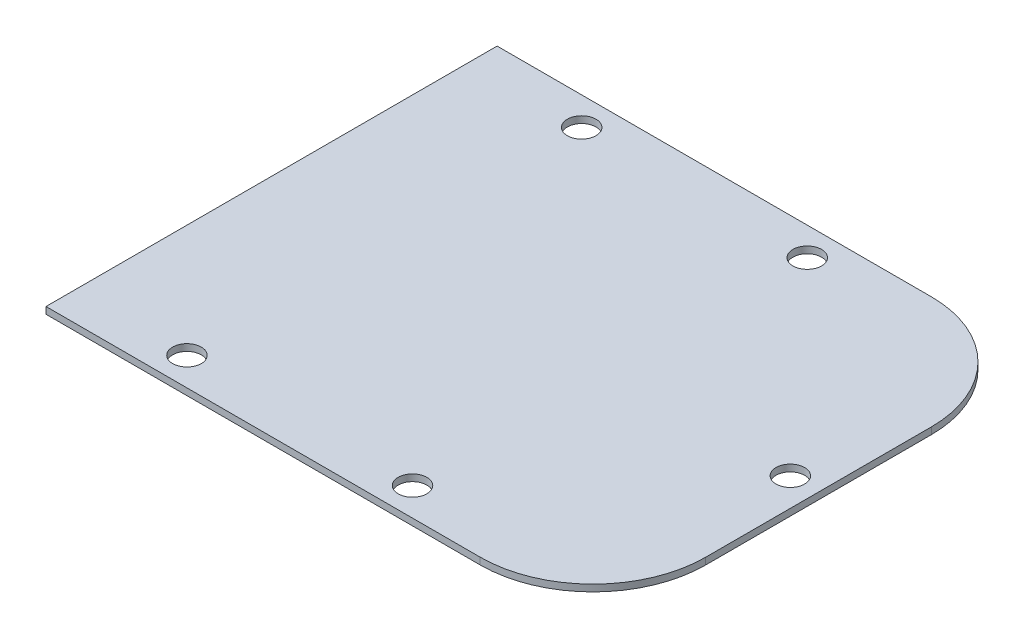
ISO-10303-21;
HEADER;
FILE_DESCRIPTION(('STEP AP214'),'2;1');
FILE_NAME('part.step','',(''),(''),'','','');
FILE_SCHEMA(('AUTOMOTIVE_DESIGN { 1 0 10303 214 1 1 1 1 }'));
ENDSEC;
DATA;
#1=APPLICATION_CONTEXT('core data for automotive mechanical design processes');
#2=APPLICATION_PROTOCOL_DEFINITION('international standard','automotive_design',2000,#1);
#3=PRODUCT_CONTEXT('',#1,'mechanical');
#4=PRODUCT('Part','Part','',(#3));
#5=PRODUCT_RELATED_PRODUCT_CATEGORY('part','',(#4));
#6=PRODUCT_DEFINITION_FORMATION('','',#4);
#7=PRODUCT_DEFINITION_CONTEXT('part definition',#1,'design');
#8=PRODUCT_DEFINITION('design','',#6,#7);
#9=PRODUCT_DEFINITION_SHAPE('','',#8);
#10=(LENGTH_UNIT() NAMED_UNIT(*) SI_UNIT(.MILLI.,.METRE.));
#11=(NAMED_UNIT(*) PLANE_ANGLE_UNIT() SI_UNIT($,.RADIAN.));
#12=(NAMED_UNIT(*) SI_UNIT($,.STERADIAN.) SOLID_ANGLE_UNIT());
#13=UNCERTAINTY_MEASURE_WITH_UNIT(LENGTH_MEASURE(1.E-05),#10,'distance_accuracy_value','');
#14=(GEOMETRIC_REPRESENTATION_CONTEXT(3) GLOBAL_UNCERTAINTY_ASSIGNED_CONTEXT((#13)) GLOBAL_UNIT_ASSIGNED_CONTEXT((#10,
#11,#12)) REPRESENTATION_CONTEXT('',''));
#15=CARTESIAN_POINT('',(0.,0.,0.));
#16=DIRECTION('',(0.,0.,1.));
#17=DIRECTION('',(1.,0.,0.));
#18=AXIS2_PLACEMENT_3D('',#15,#16,#17);
#19=CARTESIAN_POINT('',(15.39875,0.381,-12.7));
#20=DIRECTION('',(0.,-1.,0.));
#21=DIRECTION('',(0.,0.,-1.));
#22=AXIS2_PLACEMENT_3D('',#19,#20,#21);
#23=PLANE('',#22);
#24=CARTESIAN_POINT('',(3.65124999999999,0.381,-11.1125));
#25=DIRECTION('',(0.,1.,0.));
#26=DIRECTION('',(0.,0.,1.));
#27=AXIS2_PLACEMENT_3D('',#24,#25,#26);
#28=CIRCLE('',#27,0.806449999999997);
#29=CARTESIAN_POINT('',(3.65124999999999,0.381,-10.30605));
#30=VERTEX_POINT('',#29);
#31=EDGE_CURVE('E282',#30,#30,#28,.T.);
#32=ORIENTED_EDGE('',*,*,#31,.F.);
#33=EDGE_LOOP('',(#32));
#34=FACE_BOUND('',#33,.T.);
#35=DIRECTION('',(0.,0.,-1.));
#36=VECTOR('',#35,1.);
#37=CARTESIAN_POINT('',(15.39875,0.381,12.7));
#38=LINE('',#37,#36);
#39=CARTESIAN_POINT('',(15.39875,0.381,6.35));
#40=VERTEX_POINT('',#39);
#41=CARTESIAN_POINT('',(15.39875,0.381,-6.35));
#42=VERTEX_POINT('',#41);
#43=EDGE_CURVE('E99',#40,#42,#38,.T.);
#44=ORIENTED_EDGE('',*,*,#43,.T.);
#45=CARTESIAN_POINT('',(9.04874999999999,0.381,-6.35));
#46=DIRECTION('',(0.,-1.,0.));
#47=DIRECTION('',(0.,0.,-1.));
#48=AXIS2_PLACEMENT_3D('',#45,#46,#47);
#49=CIRCLE('',#48,6.35);
#50=CARTESIAN_POINT('',(9.04874999999999,0.381,-12.7));
#51=VERTEX_POINT('',#50);
#52=EDGE_CURVE('E42',#42,#51,#49,.F.);
#53=ORIENTED_EDGE('',*,*,#52,.T.);
#54=DIRECTION('',(-1.,0.,0.));
#55=VECTOR('',#54,1.);
#56=CARTESIAN_POINT('',(-15.39875,0.381,-12.7));
#57=LINE('',#56,#55);
#58=CARTESIAN_POINT('',(-15.39875,0.381,-12.7));
#59=VERTEX_POINT('',#58);
#60=EDGE_CURVE('E89',#51,#59,#57,.T.);
#61=ORIENTED_EDGE('',*,*,#60,.T.);
#62=DIRECTION('',(0.,0.,1.));
#63=VECTOR('',#62,1.);
#64=CARTESIAN_POINT('',(-15.39875,0.381,12.7));
#65=LINE('',#64,#63);
#66=CARTESIAN_POINT('',(-15.39875,0.381,12.7));
#67=VERTEX_POINT('',#66);
#68=EDGE_CURVE('E93',#59,#67,#65,.T.);
#69=ORIENTED_EDGE('',*,*,#68,.T.);
#70=DIRECTION('',(1.,0.,0.));
#71=VECTOR('',#70,1.);
#72=CARTESIAN_POINT('',(-15.39875,0.381,12.7));
#73=LINE('',#72,#71);
#74=CARTESIAN_POINT('',(9.04874999999999,0.381,12.7));
#75=VERTEX_POINT('',#74);
#76=EDGE_CURVE('E113',#67,#75,#73,.T.);
#77=ORIENTED_EDGE('',*,*,#76,.T.);
#78=CARTESIAN_POINT('',(9.04874999999999,0.381,6.35));
#79=DIRECTION('',(0.,-1.,0.));
#80=DIRECTION('',(0.,0.,-1.));
#81=AXIS2_PLACEMENT_3D('',#78,#79,#80);
#82=CIRCLE('',#81,6.35);
#83=EDGE_CURVE('E136',#75,#40,#82,.F.);
#84=ORIENTED_EDGE('',*,*,#83,.T.);
#85=EDGE_LOOP('',(#44,#53,#61,#69,#77,#84));
#86=FACE_BOUND('',#85,.T.);
#87=CARTESIAN_POINT('',(3.65124999999999,0.381,11.1125));
#88=DIRECTION('',(0.,1.,0.));
#89=DIRECTION('',(0.,0.,1.));
#90=AXIS2_PLACEMENT_3D('',#87,#88,#89);
#91=CIRCLE('',#90,0.806449999999997);
#92=CARTESIAN_POINT('',(3.65124999999999,0.381,11.91895));
#93=VERTEX_POINT('',#92);
#94=EDGE_CURVE('E140',#93,#93,#91,.T.);
#95=ORIENTED_EDGE('',*,*,#94,.F.);
#96=EDGE_LOOP('',(#95));
#97=FACE_BOUND('',#96,.T.);
#98=CARTESIAN_POINT('',(-9.04875000000001,0.381,11.1125));
#99=DIRECTION('',(0.,1.,0.));
#100=DIRECTION('',(0.,0.,1.));
#101=AXIS2_PLACEMENT_3D('',#98,#99,#100);
#102=CIRCLE('',#101,0.806449999999997);
#103=CARTESIAN_POINT('',(-9.04875000000001,0.381,11.91895));
#104=VERTEX_POINT('',#103);
#105=EDGE_CURVE('E141',#104,#104,#102,.T.);
#106=ORIENTED_EDGE('',*,*,#105,.F.);
#107=EDGE_LOOP('',(#106));
#108=FACE_BOUND('',#107,.T.);
#109=CARTESIAN_POINT('',(13.81125,0.381,0.));
#110=DIRECTION('',(0.,1.,0.));
#111=DIRECTION('',(0.,0.,1.));
#112=AXIS2_PLACEMENT_3D('',#109,#110,#111);
#113=CIRCLE('',#112,0.806449999999997);
#114=CARTESIAN_POINT('',(13.81125,0.381,0.806449999999999));
#115=VERTEX_POINT('',#114);
#116=EDGE_CURVE('E151',#115,#115,#113,.T.);
#117=ORIENTED_EDGE('',*,*,#116,.F.);
#118=EDGE_LOOP('',(#117));
#119=FACE_BOUND('',#118,.T.);
#120=CARTESIAN_POINT('',(-9.04875000000001,0.381,-11.1125));
#121=DIRECTION('',(0.,1.,0.));
#122=DIRECTION('',(0.,0.,1.));
#123=AXIS2_PLACEMENT_3D('',#120,#121,#122);
#124=CIRCLE('',#123,0.806449999999997);
#125=CARTESIAN_POINT('',(-9.04875000000001,0.381,-10.30605));
#126=VERTEX_POINT('',#125);
#127=EDGE_CURVE('E279',#126,#126,#124,.T.);
#128=ORIENTED_EDGE('',*,*,#127,.F.);
#129=EDGE_LOOP('',(#128));
#130=FACE_BOUND('',#129,.T.);
#131=ADVANCED_FACE('F33',(#34,#86,#97,#108,#119,#130),#23,.F.);
#132=CARTESIAN_POINT('',(15.39875,0.381,12.7));
#133=DIRECTION('',(-1.,0.,0.));
#134=DIRECTION('',(0.,0.,1.));
#135=AXIS2_PLACEMENT_3D('',#132,#133,#134);
#136=PLANE('',#135);
#137=DIRECTION('',(0.,0.,-1.));
#138=VECTOR('',#137,1.);
#139=CARTESIAN_POINT('',(15.39875,0.,12.7));
#140=LINE('',#139,#138);
#141=CARTESIAN_POINT('',(15.39875,0.,6.35));
#142=VERTEX_POINT('',#141);
#143=CARTESIAN_POINT('',(15.39875,0.,-6.35));
#144=VERTEX_POINT('',#143);
#145=EDGE_CURVE('E118',#142,#144,#140,.T.);
#146=ORIENTED_EDGE('',*,*,#145,.T.);
#147=DIRECTION('',(0.,-1.,0.));
#148=VECTOR('',#147,1.);
#149=CARTESIAN_POINT('',(15.39875,0.381,-6.35));
#150=LINE('',#149,#148);
#151=EDGE_CURVE('E56',#144,#42,#150,.F.);
#152=ORIENTED_EDGE('',*,*,#151,.T.);
#153=ORIENTED_EDGE('',*,*,#43,.F.);
#154=DIRECTION('',(0.,-1.,0.));
#155=VECTOR('',#154,1.);
#156=CARTESIAN_POINT('',(15.39875,0.381,6.35));
#157=LINE('',#156,#155);
#158=EDGE_CURVE('E132',#40,#142,#157,.T.);
#159=ORIENTED_EDGE('',*,*,#158,.T.);
#160=EDGE_LOOP('',(#146,#152,#153,#159));
#161=FACE_BOUND('',#160,.T.);
#162=ADVANCED_FACE('F166',(#161),#136,.F.);
#163=CARTESIAN_POINT('',(-15.39875,0.381,-12.7));
#164=DIRECTION('',(0.,0.,1.));
#165=DIRECTION('',(1.,0.,0.));
#166=AXIS2_PLACEMENT_3D('',#163,#164,#165);
#167=PLANE('',#166);
#168=ORIENTED_EDGE('',*,*,#60,.F.);
#169=DIRECTION('',(0.,-1.,0.));
#170=VECTOR('',#169,1.);
#171=CARTESIAN_POINT('',(9.04874999999999,0.381,-12.7));
#172=LINE('',#171,#170);
#173=CARTESIAN_POINT('',(9.04874999999999,0.,-12.7));
#174=VERTEX_POINT('',#173);
#175=EDGE_CURVE('E108',#51,#174,#172,.T.);
#176=ORIENTED_EDGE('',*,*,#175,.T.);
#177=DIRECTION('',(-1.,0.,0.));
#178=VECTOR('',#177,1.);
#179=CARTESIAN_POINT('',(-15.39875,0.,-12.7));
#180=LINE('',#179,#178);
#181=CARTESIAN_POINT('',(-15.39875,0.,-12.7));
#182=VERTEX_POINT('',#181);
#183=EDGE_CURVE('E105',#174,#182,#180,.T.);
#184=ORIENTED_EDGE('',*,*,#183,.T.);
#185=DIRECTION('',(0.,-1.,0.));
#186=VECTOR('',#185,1.);
#187=CARTESIAN_POINT('',(-15.39875,0.381,-12.7));
#188=LINE('',#187,#186);
#189=EDGE_CURVE('E102',#59,#182,#188,.T.);
#190=ORIENTED_EDGE('',*,*,#189,.F.);
#191=EDGE_LOOP('',(#168,#176,#184,#190));
#192=FACE_BOUND('',#191,.T.);
#193=ADVANCED_FACE('F103',(#192),#167,.F.);
#194=CARTESIAN_POINT('',(-15.39875,0.381,12.7));
#195=DIRECTION('',(1.,0.,0.));
#196=DIRECTION('',(0.,0.,-1.));
#197=AXIS2_PLACEMENT_3D('',#194,#195,#196);
#198=PLANE('',#197);
#199=DIRECTION('',(0.,0.,1.));
#200=VECTOR('',#199,1.);
#201=CARTESIAN_POINT('',(-15.39875,0.,12.7));
#202=LINE('',#201,#200);
#203=CARTESIAN_POINT('',(-15.39875,0.,12.7));
#204=VERTEX_POINT('',#203);
#205=EDGE_CURVE('E122',#182,#204,#202,.T.);
#206=ORIENTED_EDGE('',*,*,#205,.T.);
#207=DIRECTION('',(0.,-1.,0.));
#208=VECTOR('',#207,1.);
#209=CARTESIAN_POINT('',(-15.39875,0.381,12.7));
#210=LINE('',#209,#208);
#211=EDGE_CURVE('E109',#67,#204,#210,.T.);
#212=ORIENTED_EDGE('',*,*,#211,.F.);
#213=ORIENTED_EDGE('',*,*,#68,.F.);
#214=ORIENTED_EDGE('',*,*,#189,.T.);
#215=EDGE_LOOP('',(#206,#212,#213,#214));
#216=FACE_BOUND('',#215,.T.);
#217=ADVANCED_FACE('F111',(#216),#198,.F.);
#218=CARTESIAN_POINT('',(-15.39875,0.381,12.7));
#219=DIRECTION('',(0.,0.,-1.));
#220=DIRECTION('',(-1.,0.,0.));
#221=AXIS2_PLACEMENT_3D('',#218,#219,#220);
#222=PLANE('',#221);
#223=DIRECTION('',(1.,0.,0.));
#224=VECTOR('',#223,1.);
#225=CARTESIAN_POINT('',(-15.39875,0.,12.7));
#226=LINE('',#225,#224);
#227=CARTESIAN_POINT('',(9.04874999999999,0.,12.7));
#228=VERTEX_POINT('',#227);
#229=EDGE_CURVE('E124',#204,#228,#226,.T.);
#230=ORIENTED_EDGE('',*,*,#229,.T.);
#231=DIRECTION('',(0.,-1.,0.));
#232=VECTOR('',#231,1.);
#233=CARTESIAN_POINT('',(9.04874999999999,0.381,12.7));
#234=LINE('',#233,#232);
#235=EDGE_CURVE('E11',#228,#75,#234,.F.);
#236=ORIENTED_EDGE('',*,*,#235,.T.);
#237=ORIENTED_EDGE('',*,*,#76,.F.);
#238=ORIENTED_EDGE('',*,*,#211,.T.);
#239=EDGE_LOOP('',(#230,#236,#237,#238));
#240=FACE_BOUND('',#239,.T.);
#241=ADVANCED_FACE('F164',(#240),#222,.F.);
#242=CARTESIAN_POINT('',(15.39875,0.,-12.7));
#243=DIRECTION('',(0.,-1.,0.));
#244=DIRECTION('',(0.,0.,-1.));
#245=AXIS2_PLACEMENT_3D('',#242,#243,#244);
#246=PLANE('',#245);
#247=CARTESIAN_POINT('',(-9.04875000000001,0.,-11.1125));
#248=DIRECTION('',(0.,-1.,0.));
#249=DIRECTION('',(0.,0.,-1.));
#250=AXIS2_PLACEMENT_3D('',#247,#248,#249);
#251=CIRCLE('',#250,0.806449999999995);
#252=CARTESIAN_POINT('',(-9.04875000000001,0.,-11.91895));
#253=VERTEX_POINT('',#252);
#254=EDGE_CURVE('E276',#253,#253,#251,.T.);
#255=ORIENTED_EDGE('',*,*,#254,.F.);
#256=EDGE_LOOP('',(#255));
#257=FACE_BOUND('',#256,.T.);
#258=CARTESIAN_POINT('',(3.65124999999999,0.,-11.1125));
#259=DIRECTION('',(0.,-1.,0.));
#260=DIRECTION('',(0.,0.,-1.));
#261=AXIS2_PLACEMENT_3D('',#258,#259,#260);
#262=CIRCLE('',#261,0.806449999999995);
#263=CARTESIAN_POINT('',(3.65124999999999,0.,-11.91895));
#264=VERTEX_POINT('',#263);
#265=EDGE_CURVE('E286',#264,#264,#262,.T.);
#266=ORIENTED_EDGE('',*,*,#265,.F.);
#267=EDGE_LOOP('',(#266));
#268=FACE_BOUND('',#267,.T.);
#269=CARTESIAN_POINT('',(13.81125,0.,0.));
#270=DIRECTION('',(0.,-1.,0.));
#271=DIRECTION('',(0.,0.,-1.));
#272=AXIS2_PLACEMENT_3D('',#269,#270,#271);
#273=CIRCLE('',#272,0.806449999999995);
#274=CARTESIAN_POINT('',(13.81125,0.,-0.806449999999992));
#275=VERTEX_POINT('',#274);
#276=EDGE_CURVE('E37',#275,#275,#273,.T.);
#277=ORIENTED_EDGE('',*,*,#276,.F.);
#278=EDGE_LOOP('',(#277));
#279=FACE_BOUND('',#278,.T.);
#280=CARTESIAN_POINT('',(-9.04875000000001,0.,11.1125));
#281=DIRECTION('',(0.,-1.,0.));
#282=DIRECTION('',(0.,0.,-1.));
#283=AXIS2_PLACEMENT_3D('',#280,#281,#282);
#284=CIRCLE('',#283,0.806449999999995);
#285=CARTESIAN_POINT('',(-9.04875000000001,0.,10.30605));
#286=VERTEX_POINT('',#285);
#287=EDGE_CURVE('E138',#286,#286,#284,.T.);
#288=ORIENTED_EDGE('',*,*,#287,.F.);
#289=EDGE_LOOP('',(#288));
#290=FACE_BOUND('',#289,.T.);
#291=CARTESIAN_POINT('',(3.65124999999999,0.,11.1125));
#292=DIRECTION('',(0.,-1.,0.));
#293=DIRECTION('',(0.,0.,-1.));
#294=AXIS2_PLACEMENT_3D('',#291,#292,#293);
#295=CIRCLE('',#294,0.806449999999995);
#296=CARTESIAN_POINT('',(3.65124999999999,0.,10.30605));
#297=VERTEX_POINT('',#296);
#298=EDGE_CURVE('E120',#297,#297,#295,.T.);
#299=ORIENTED_EDGE('',*,*,#298,.F.);
#300=EDGE_LOOP('',(#299));
#301=FACE_BOUND('',#300,.T.);
#302=ORIENTED_EDGE('',*,*,#183,.F.);
#303=CARTESIAN_POINT('',(9.04874999999999,0.,-6.35));
#304=DIRECTION('',(0.,-1.,0.));
#305=DIRECTION('',(0.,0.,-1.));
#306=AXIS2_PLACEMENT_3D('',#303,#304,#305);
#307=CIRCLE('',#306,6.35);
#308=EDGE_CURVE('E130',#174,#144,#307,.T.);
#309=ORIENTED_EDGE('',*,*,#308,.T.);
#310=ORIENTED_EDGE('',*,*,#145,.F.);
#311=CARTESIAN_POINT('',(9.04874999999999,0.,6.35));
#312=DIRECTION('',(0.,-1.,0.));
#313=DIRECTION('',(0.,0.,-1.));
#314=AXIS2_PLACEMENT_3D('',#311,#312,#313);
#315=CIRCLE('',#314,6.35);
#316=EDGE_CURVE('E128',#142,#228,#315,.T.);
#317=ORIENTED_EDGE('',*,*,#316,.T.);
#318=ORIENTED_EDGE('',*,*,#229,.F.);
#319=ORIENTED_EDGE('',*,*,#205,.F.);
#320=EDGE_LOOP('',(#302,#309,#310,#317,#318,#319));
#321=FACE_BOUND('',#320,.T.);
#322=ADVANCED_FACE('F161',(#257,#268,#279,#290,#301,#321),#246,.T.);
#323=CARTESIAN_POINT('',(9.04874999999999,0.381,-6.35));
#324=DIRECTION('',(0.,-1.,0.));
#325=DIRECTION('',(0.,0.,-1.));
#326=AXIS2_PLACEMENT_3D('',#323,#324,#325);
#327=CYLINDRICAL_SURFACE('',#326,6.35);
#328=ORIENTED_EDGE('',*,*,#52,.F.);
#329=ORIENTED_EDGE('',*,*,#151,.F.);
#330=ORIENTED_EDGE('',*,*,#308,.F.);
#331=ORIENTED_EDGE('',*,*,#175,.F.);
#332=EDGE_LOOP('',(#328,#329,#330,#331));
#333=FACE_BOUND('',#332,.T.);
#334=ADVANCED_FACE('F159',(#333),#327,.T.);
#335=CARTESIAN_POINT('',(9.04874999999999,0.381,6.35));
#336=DIRECTION('',(0.,-1.,0.));
#337=DIRECTION('',(0.,0.,-1.));
#338=AXIS2_PLACEMENT_3D('',#335,#336,#337);
#339=CYLINDRICAL_SURFACE('',#338,6.35);
#340=ORIENTED_EDGE('',*,*,#83,.F.);
#341=ORIENTED_EDGE('',*,*,#235,.F.);
#342=ORIENTED_EDGE('',*,*,#316,.F.);
#343=ORIENTED_EDGE('',*,*,#158,.F.);
#344=EDGE_LOOP('',(#340,#341,#342,#343));
#345=FACE_BOUND('',#344,.T.);
#346=ADVANCED_FACE('F35',(#345),#339,.T.);
#347=CARTESIAN_POINT('',(3.65124999999999,0.381,11.1125));
#348=DIRECTION('',(0.,1.,0.));
#349=DIRECTION('',(0.,0.,1.));
#350=AXIS2_PLACEMENT_3D('',#347,#348,#349);
#351=CYLINDRICAL_SURFACE('',#350,0.806449999999995);
#352=ORIENTED_EDGE('',*,*,#298,.T.);
#353=EDGE_LOOP('',(#352));
#354=FACE_BOUND('',#353,.T.);
#355=ORIENTED_EDGE('',*,*,#94,.T.);
#356=EDGE_LOOP('',(#355));
#357=FACE_BOUND('',#356,.T.);
#358=ADVANCED_FACE('F182',(#354,#357),#351,.F.);
#359=CARTESIAN_POINT('',(-9.04875000000001,0.381,11.1125));
#360=DIRECTION('',(0.,1.,0.));
#361=DIRECTION('',(0.,0.,1.));
#362=AXIS2_PLACEMENT_3D('',#359,#360,#361);
#363=CYLINDRICAL_SURFACE('',#362,0.806449999999995);
#364=ORIENTED_EDGE('',*,*,#287,.T.);
#365=EDGE_LOOP('',(#364));
#366=FACE_BOUND('',#365,.T.);
#367=ORIENTED_EDGE('',*,*,#105,.T.);
#368=EDGE_LOOP('',(#367));
#369=FACE_BOUND('',#368,.T.);
#370=ADVANCED_FACE('F232',(#366,#369),#363,.F.);
#371=CARTESIAN_POINT('',(13.81125,0.381,0.));
#372=DIRECTION('',(0.,1.,0.));
#373=DIRECTION('',(0.,0.,1.));
#374=AXIS2_PLACEMENT_3D('',#371,#372,#373);
#375=CYLINDRICAL_SURFACE('',#374,0.806449999999995);
#376=ORIENTED_EDGE('',*,*,#276,.T.);
#377=EDGE_LOOP('',(#376));
#378=FACE_BOUND('',#377,.T.);
#379=ORIENTED_EDGE('',*,*,#116,.T.);
#380=EDGE_LOOP('',(#379));
#381=FACE_BOUND('',#380,.T.);
#382=ADVANCED_FACE('F241',(#378,#381),#375,.F.);
#383=CARTESIAN_POINT('',(3.65124999999999,0.381,-11.1125));
#384=DIRECTION('',(0.,1.,0.));
#385=DIRECTION('',(0.,0.,1.));
#386=AXIS2_PLACEMENT_3D('',#383,#384,#385);
#387=CYLINDRICAL_SURFACE('',#386,0.806449999999995);
#388=ORIENTED_EDGE('',*,*,#265,.T.);
#389=EDGE_LOOP('',(#388));
#390=FACE_BOUND('',#389,.T.);
#391=ORIENTED_EDGE('',*,*,#31,.T.);
#392=EDGE_LOOP('',(#391));
#393=FACE_BOUND('',#392,.T.);
#394=ADVANCED_FACE('F250',(#390,#393),#387,.F.);
#395=CARTESIAN_POINT('',(-9.04875000000001,0.381,-11.1125));
#396=DIRECTION('',(0.,1.,0.));
#397=DIRECTION('',(0.,0.,1.));
#398=AXIS2_PLACEMENT_3D('',#395,#396,#397);
#399=CYLINDRICAL_SURFACE('',#398,0.806449999999995);
#400=ORIENTED_EDGE('',*,*,#254,.T.);
#401=EDGE_LOOP('',(#400));
#402=FACE_BOUND('',#401,.T.);
#403=ORIENTED_EDGE('',*,*,#127,.T.);
#404=EDGE_LOOP('',(#403));
#405=FACE_BOUND('',#404,.T.);
#406=ADVANCED_FACE('F260',(#402,#405),#399,.F.);
#407=CLOSED_SHELL('',(#131,#162,#193,#217,#241,#322,#334,#346,#358,#370,#382,#394,#406));
#408=MANIFOLD_SOLID_BREP('B2',#407);
#409=ADVANCED_BREP_SHAPE_REPRESENTATION('',(#18,#408),#14);
#410=SHAPE_DEFINITION_REPRESENTATION(#9,#409);
ENDSEC;
END-ISO-10303-21;
